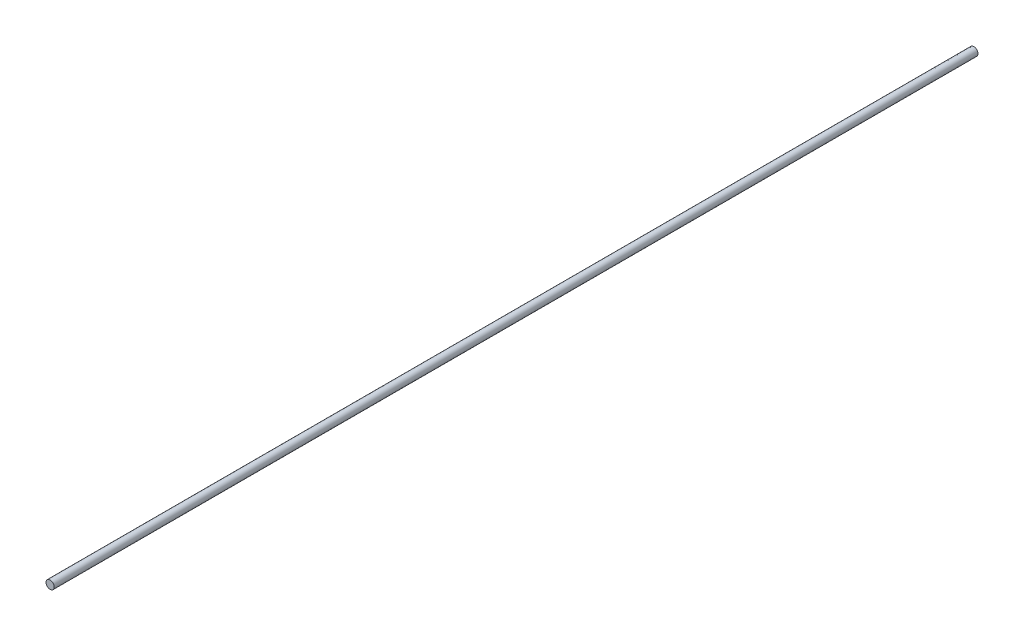
ISO-10303-21;
HEADER;
FILE_DESCRIPTION(('STEP AP214'),'2;1');
FILE_NAME('part.step','',(''),(''),'','','');
FILE_SCHEMA(('AUTOMOTIVE_DESIGN { 1 0 10303 214 1 1 1 1 }'));
ENDSEC;
DATA;
#1=APPLICATION_CONTEXT('core data for automotive mechanical design processes');
#2=APPLICATION_PROTOCOL_DEFINITION('international standard','automotive_design',2000,#1);
#3=PRODUCT_CONTEXT('',#1,'mechanical');
#4=PRODUCT('Part','Part','',(#3));
#5=PRODUCT_RELATED_PRODUCT_CATEGORY('part','',(#4));
#6=PRODUCT_DEFINITION_FORMATION('','',#4);
#7=PRODUCT_DEFINITION_CONTEXT('part definition',#1,'design');
#8=PRODUCT_DEFINITION('design','',#6,#7);
#9=PRODUCT_DEFINITION_SHAPE('','',#8);
#10=(LENGTH_UNIT() NAMED_UNIT(*) SI_UNIT(.MILLI.,.METRE.));
#11=(NAMED_UNIT(*) PLANE_ANGLE_UNIT() SI_UNIT($,.RADIAN.));
#12=(NAMED_UNIT(*) SI_UNIT($,.STERADIAN.) SOLID_ANGLE_UNIT());
#13=UNCERTAINTY_MEASURE_WITH_UNIT(LENGTH_MEASURE(1.E-05),#10,'distance_accuracy_value','');
#14=(GEOMETRIC_REPRESENTATION_CONTEXT(3) GLOBAL_UNCERTAINTY_ASSIGNED_CONTEXT((#13)) GLOBAL_UNIT_ASSIGNED_CONTEXT((#10,
#11,#12)) REPRESENTATION_CONTEXT('',''));
#15=CARTESIAN_POINT('',(0.,0.,0.));
#16=DIRECTION('',(0.,0.,1.));
#17=DIRECTION('',(1.,0.,0.));
#18=AXIS2_PLACEMENT_3D('',#15,#16,#17);
#19=CARTESIAN_POINT('',(0.,0.,563.));
#20=DIRECTION('',(0.,0.,-1.));
#21=DIRECTION('',(-1.,0.,0.));
#22=AXIS2_PLACEMENT_3D('',#19,#20,#21);
#23=CYLINDRICAL_SURFACE('',#22,2.5);
#24=CARTESIAN_POINT('',(0.,0.,563.));
#25=DIRECTION('',(0.,0.,1.));
#26=DIRECTION('',(1.,0.,0.));
#27=AXIS2_PLACEMENT_3D('',#24,#25,#26);
#28=CIRCLE('',#27,2.5);
#29=CARTESIAN_POINT('',(2.5,0.,563.));
#30=VERTEX_POINT('',#29);
#31=EDGE_CURVE('E10',#30,#30,#28,.T.);
#32=ORIENTED_EDGE('',*,*,#31,.F.);
#33=EDGE_LOOP('',(#32));
#34=FACE_BOUND('',#33,.T.);
#35=CARTESIAN_POINT('',(0.,0.,0.));
#36=DIRECTION('',(0.,0.,1.));
#37=DIRECTION('',(1.,0.,0.));
#38=AXIS2_PLACEMENT_3D('',#35,#36,#37);
#39=CIRCLE('',#38,2.5);
#40=CARTESIAN_POINT('',(2.5,0.,0.));
#41=VERTEX_POINT('',#40);
#42=EDGE_CURVE('E44',#41,#41,#39,.T.);
#43=ORIENTED_EDGE('',*,*,#42,.T.);
#44=EDGE_LOOP('',(#43));
#45=FACE_BOUND('',#44,.T.);
#46=ADVANCED_FACE('F41',(#34,#45),#23,.T.);
#47=CARTESIAN_POINT('',(0.,0.,563.));
#48=DIRECTION('',(0.,0.,1.));
#49=DIRECTION('',(1.,0.,0.));
#50=AXIS2_PLACEMENT_3D('',#47,#48,#49);
#51=PLANE('',#50);
#52=ORIENTED_EDGE('',*,*,#31,.T.);
#53=EDGE_LOOP('',(#52));
#54=FACE_BOUND('',#53,.T.);
#55=ADVANCED_FACE('F56',(#54),#51,.T.);
#56=CARTESIAN_POINT('',(0.,0.,0.));
#57=DIRECTION('',(0.,0.,1.));
#58=DIRECTION('',(1.,0.,0.));
#59=AXIS2_PLACEMENT_3D('',#56,#57,#58);
#60=PLANE('',#59);
#61=ORIENTED_EDGE('',*,*,#42,.F.);
#62=EDGE_LOOP('',(#61));
#63=FACE_BOUND('',#62,.T.);
#64=ADVANCED_FACE('F54',(#63),#60,.F.);
#65=CLOSED_SHELL('',(#46,#55,#64));
#66=MANIFOLD_SOLID_BREP('B2',#65);
#67=ADVANCED_BREP_SHAPE_REPRESENTATION('',(#18,#66),#14);
#68=SHAPE_DEFINITION_REPRESENTATION(#9,#67);
ENDSEC;
END-ISO-10303-21;
